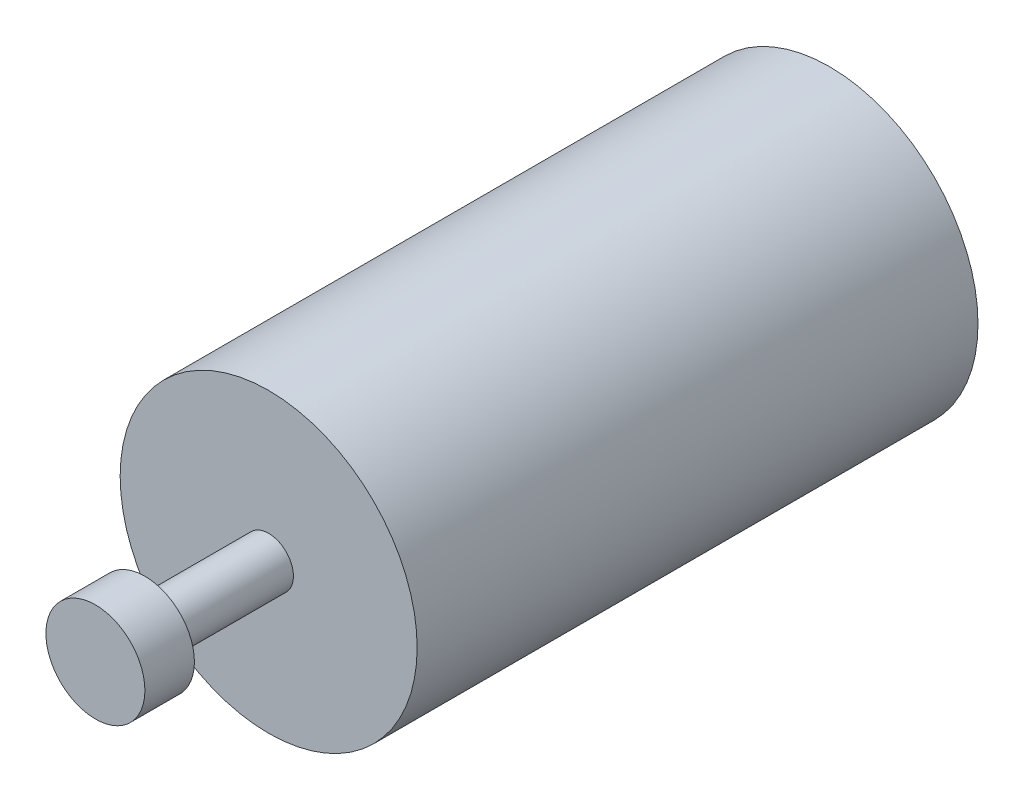
ISO-10303-21;
HEADER;
FILE_DESCRIPTION(('STEP AP214'),'2;1');
FILE_NAME('part.step','',(''),(''),'','','');
FILE_SCHEMA(('AUTOMOTIVE_DESIGN { 1 0 10303 214 1 1 1 1 }'));
ENDSEC;
DATA;
#1=APPLICATION_CONTEXT('core data for automotive mechanical design processes');
#2=APPLICATION_PROTOCOL_DEFINITION('international standard','automotive_design',2000,#1);
#3=PRODUCT_CONTEXT('',#1,'mechanical');
#4=PRODUCT('Part','Part','',(#3));
#5=PRODUCT_RELATED_PRODUCT_CATEGORY('part','',(#4));
#6=PRODUCT_DEFINITION_FORMATION('','',#4);
#7=PRODUCT_DEFINITION_CONTEXT('part definition',#1,'design');
#8=PRODUCT_DEFINITION('design','',#6,#7);
#9=PRODUCT_DEFINITION_SHAPE('','',#8);
#10=(LENGTH_UNIT() NAMED_UNIT(*) SI_UNIT(.MILLI.,.METRE.));
#11=(NAMED_UNIT(*) PLANE_ANGLE_UNIT() SI_UNIT($,.RADIAN.));
#12=(NAMED_UNIT(*) SI_UNIT($,.STERADIAN.) SOLID_ANGLE_UNIT());
#13=UNCERTAINTY_MEASURE_WITH_UNIT(LENGTH_MEASURE(1.E-05),#10,'distance_accuracy_value','');
#14=(GEOMETRIC_REPRESENTATION_CONTEXT(3) GLOBAL_UNCERTAINTY_ASSIGNED_CONTEXT((#13)) GLOBAL_UNIT_ASSIGNED_CONTEXT((#10,
#11,#12)) REPRESENTATION_CONTEXT('',''));
#15=CARTESIAN_POINT('',(0.,0.,0.));
#16=DIRECTION('',(0.,0.,1.));
#17=DIRECTION('',(1.,0.,0.));
#18=AXIS2_PLACEMENT_3D('',#15,#16,#17);
#19=CARTESIAN_POINT('',(0.,0.,14.478));
#20=DIRECTION('',(0.,0.,-1.));
#21=DIRECTION('',(-1.,0.,0.));
#22=AXIS2_PLACEMENT_3D('',#19,#20,#21);
#23=CYLINDRICAL_SURFACE('',#22,3.175);
#24=CARTESIAN_POINT('',(0.,0.,0.));
#25=DIRECTION('',(0.,0.,1.));
#26=DIRECTION('',(1.,0.,0.));
#27=AXIS2_PLACEMENT_3D('',#24,#25,#26);
#28=CIRCLE('',#27,3.175);
#29=CARTESIAN_POINT('',(-1.27,2.90993556629696,0.));
#30=VERTEX_POINT('',#29);
#31=CARTESIAN_POINT('',(1.27,2.90993556629696,0.));
#32=VERTEX_POINT('',#31);
#33=EDGE_CURVE('E87',#30,#32,#28,.T.);
#34=ORIENTED_EDGE('',*,*,#33,.T.);
#35=DIRECTION('',(0.,0.,-1.));
#36=VECTOR('',#35,1.);
#37=CARTESIAN_POINT('',(1.27,2.90993556629696,14.478));
#38=LINE('',#37,#36);
#39=CARTESIAN_POINT('',(1.27,2.90993556629696,14.478));
#40=VERTEX_POINT('',#39);
#41=EDGE_CURVE('E89',#32,#40,#38,.F.);
#42=ORIENTED_EDGE('',*,*,#41,.T.);
#43=CARTESIAN_POINT('',(0.,0.,14.478));
#44=DIRECTION('',(0.,0.,1.));
#45=DIRECTION('',(1.,0.,0.));
#46=AXIS2_PLACEMENT_3D('',#43,#44,#45);
#47=CIRCLE('',#46,3.175);
#48=CARTESIAN_POINT('',(-1.27,2.90993556629696,14.478));
#49=VERTEX_POINT('',#48);
#50=EDGE_CURVE('E95',#49,#40,#47,.T.);
#51=ORIENTED_EDGE('',*,*,#50,.F.);
#52=DIRECTION('',(0.,0.,-1.));
#53=VECTOR('',#52,1.);
#54=CARTESIAN_POINT('',(-1.27,2.90993556629696,14.478));
#55=LINE('',#54,#53);
#56=EDGE_CURVE('E61',#49,#30,#55,.T.);
#57=ORIENTED_EDGE('',*,*,#56,.T.);
#58=EDGE_LOOP('',(#34,#42,#51,#57));
#59=FACE_BOUND('',#58,.T.);
#60=ADVANCED_FACE('F45',(#59),#23,.T.);
#61=CARTESIAN_POINT('',(0.,0.,158.369));
#62=DIRECTION('',(0.,0.,-1.));
#63=DIRECTION('',(-1.,0.,0.));
#64=AXIS2_PLACEMENT_3D('',#61,#62,#63);
#65=CYLINDRICAL_SURFACE('',#64,38.1);
#66=CARTESIAN_POINT('',(0.,0.,158.369));
#67=DIRECTION('',(0.,0.,1.));
#68=DIRECTION('',(1.,0.,0.));
#69=AXIS2_PLACEMENT_3D('',#66,#67,#68);
#70=CIRCLE('',#69,38.1);
#71=CARTESIAN_POINT('',(38.1,0.,158.369));
#72=VERTEX_POINT('',#71);
#73=EDGE_CURVE('E96',#72,#72,#70,.T.);
#74=ORIENTED_EDGE('',*,*,#73,.F.);
#75=EDGE_LOOP('',(#74));
#76=FACE_BOUND('',#75,.T.);
#77=CARTESIAN_POINT('',(0.,0.,14.478));
#78=DIRECTION('',(0.,0.,1.));
#79=DIRECTION('',(1.,0.,0.));
#80=AXIS2_PLACEMENT_3D('',#77,#78,#79);
#81=CIRCLE('',#80,38.1);
#82=CARTESIAN_POINT('',(38.1,0.,14.478));
#83=VERTEX_POINT('',#82);
#84=EDGE_CURVE('E102',#83,#83,#81,.T.);
#85=ORIENTED_EDGE('',*,*,#84,.T.);
#86=EDGE_LOOP('',(#85));
#87=FACE_BOUND('',#86,.T.);
#88=ADVANCED_FACE('F164',(#76,#87),#65,.T.);
#89=CARTESIAN_POINT('',(0.,0.,158.369));
#90=DIRECTION('',(0.,0.,1.));
#91=DIRECTION('',(1.,0.,0.));
#92=AXIS2_PLACEMENT_3D('',#89,#90,#91);
#93=PLANE('',#92);
#94=CARTESIAN_POINT('',(0.,0.,158.369));
#95=DIRECTION('',(0.,0.,1.));
#96=DIRECTION('',(1.,0.,0.));
#97=AXIS2_PLACEMENT_3D('',#94,#95,#96);
#98=CIRCLE('',#97,6.35);
#99=CARTESIAN_POINT('',(6.35,0.,158.369));
#100=VERTEX_POINT('',#99);
#101=EDGE_CURVE('E11',#100,#100,#98,.T.);
#102=ORIENTED_EDGE('',*,*,#101,.F.);
#103=EDGE_LOOP('',(#102));
#104=FACE_BOUND('',#103,.T.);
#105=ORIENTED_EDGE('',*,*,#73,.T.);
#106=EDGE_LOOP('',(#105));
#107=FACE_BOUND('',#106,.T.);
#108=ADVANCED_FACE('F170',(#104,#107),#93,.T.);
#109=CARTESIAN_POINT('',(0.,0.,14.478));
#110=DIRECTION('',(0.,0.,1.));
#111=DIRECTION('',(1.,0.,0.));
#112=AXIS2_PLACEMENT_3D('',#109,#110,#111);
#113=PLANE('',#112);
#114=ORIENTED_EDGE('',*,*,#50,.T.);
#115=DIRECTION('',(0.,-1.,0.));
#116=VECTOR('',#115,1.);
#117=CARTESIAN_POINT('',(1.27,5.715,14.478));
#118=LINE('',#117,#116);
#119=CARTESIAN_POINT('',(1.27,5.715,14.478));
#120=VERTEX_POINT('',#119);
#121=EDGE_CURVE('E69',#120,#40,#118,.T.);
#122=ORIENTED_EDGE('',*,*,#121,.F.);
#123=DIRECTION('',(1.,0.,0.));
#124=VECTOR('',#123,1.);
#125=CARTESIAN_POINT('',(1.27,5.715,14.478));
#126=LINE('',#125,#124);
#127=CARTESIAN_POINT('',(-1.27,5.715,14.478));
#128=VERTEX_POINT('',#127);
#129=EDGE_CURVE('E109',#128,#120,#126,.T.);
#130=ORIENTED_EDGE('',*,*,#129,.F.);
#131=DIRECTION('',(0.,-1.,0.));
#132=VECTOR('',#131,1.);
#133=CARTESIAN_POINT('',(-1.27,0.,14.478));
#134=LINE('',#133,#132);
#135=EDGE_CURVE('E48',#128,#49,#134,.T.);
#136=ORIENTED_EDGE('',*,*,#135,.T.);
#137=EDGE_LOOP('',(#114,#122,#130,#136));
#138=FACE_BOUND('',#137,.T.);
#139=ORIENTED_EDGE('',*,*,#84,.F.);
#140=EDGE_LOOP('',(#139));
#141=FACE_BOUND('',#140,.T.);
#142=ADVANCED_FACE('F144',(#138,#141),#113,.F.);
#143=CARTESIAN_POINT('',(1.27,5.715,20.1576126628495));
#144=DIRECTION('',(1.,0.,0.));
#145=DIRECTION('',(0.,1.,0.));
#146=AXIS2_PLACEMENT_3D('',#143,#144,#145);
#147=PLANE('',#146);
#148=ORIENTED_EDGE('',*,*,#41,.F.);
#149=DIRECTION('',(0.,-1.,0.));
#150=VECTOR('',#149,1.);
#151=CARTESIAN_POINT('',(1.27,5.715,0.));
#152=LINE('',#151,#150);
#153=CARTESIAN_POINT('',(1.27,5.715,0.));
#154=VERTEX_POINT('',#153);
#155=EDGE_CURVE('E99',#154,#32,#152,.T.);
#156=ORIENTED_EDGE('',*,*,#155,.F.);
#157=DIRECTION('',(0.,0.,-1.));
#158=VECTOR('',#157,1.);
#159=CARTESIAN_POINT('',(1.27,5.715,20.1576126628495));
#160=LINE('',#159,#158);
#161=EDGE_CURVE('E114',#120,#154,#160,.T.);
#162=ORIENTED_EDGE('',*,*,#161,.F.);
#163=ORIENTED_EDGE('',*,*,#121,.T.);
#164=EDGE_LOOP('',(#148,#156,#162,#163));
#165=FACE_BOUND('',#164,.T.);
#166=ADVANCED_FACE('F98',(#165),#147,.T.);
#167=CARTESIAN_POINT('',(-1.27,5.715,20.1576126628495));
#168=DIRECTION('',(-1.,0.,0.));
#169=DIRECTION('',(0.,-1.,0.));
#170=AXIS2_PLACEMENT_3D('',#167,#168,#169);
#171=PLANE('',#170);
#172=ORIENTED_EDGE('',*,*,#56,.F.);
#173=ORIENTED_EDGE('',*,*,#135,.F.);
#174=DIRECTION('',(0.,0.,-1.));
#175=VECTOR('',#174,1.);
#176=CARTESIAN_POINT('',(-1.27,5.715,20.1576126628495));
#177=LINE('',#176,#175);
#178=CARTESIAN_POINT('',(-1.27,5.715,0.));
#179=VERTEX_POINT('',#178);
#180=EDGE_CURVE('E127',#128,#179,#177,.T.);
#181=ORIENTED_EDGE('',*,*,#180,.T.);
#182=DIRECTION('',(0.,1.,0.));
#183=VECTOR('',#182,1.);
#184=CARTESIAN_POINT('',(-1.27,5.715,0.));
#185=LINE('',#184,#183);
#186=EDGE_CURVE('E116',#30,#179,#185,.T.);
#187=ORIENTED_EDGE('',*,*,#186,.F.);
#188=EDGE_LOOP('',(#172,#173,#181,#187));
#189=FACE_BOUND('',#188,.T.);
#190=ADVANCED_FACE('F147',(#189),#171,.T.);
#191=CARTESIAN_POINT('',(1.27,5.715,20.1576126628495));
#192=DIRECTION('',(0.,1.,0.));
#193=DIRECTION('',(0.,0.,1.));
#194=AXIS2_PLACEMENT_3D('',#191,#192,#193);
#195=PLANE('',#194);
#196=ORIENTED_EDGE('',*,*,#180,.F.);
#197=ORIENTED_EDGE('',*,*,#129,.T.);
#198=ORIENTED_EDGE('',*,*,#161,.T.);
#199=DIRECTION('',(1.,0.,0.));
#200=VECTOR('',#199,1.);
#201=CARTESIAN_POINT('',(1.27,5.715,0.));
#202=LINE('',#201,#200);
#203=EDGE_CURVE('E107',#179,#154,#202,.T.);
#204=ORIENTED_EDGE('',*,*,#203,.F.);
#205=EDGE_LOOP('',(#196,#197,#198,#204));
#206=FACE_BOUND('',#205,.T.);
#207=ADVANCED_FACE('F149',(#206),#195,.T.);
#208=CARTESIAN_POINT('',(0.,0.,-5.08));
#209=DIRECTION('',(0.,0.,1.));
#210=DIRECTION('',(1.,0.,0.));
#211=AXIS2_PLACEMENT_3D('',#208,#209,#210);
#212=CYLINDRICAL_SURFACE('',#211,5.99953324439615);
#213=CARTESIAN_POINT('',(0.,0.,-5.08));
#214=DIRECTION('',(0.,0.,-1.));
#215=DIRECTION('',(-1.,0.,0.));
#216=AXIS2_PLACEMENT_3D('',#213,#214,#215);
#217=CIRCLE('',#216,5.99953324439615);
#218=CARTESIAN_POINT('',(-5.99953324439615,0.,-5.08));
#219=VERTEX_POINT('',#218);
#220=EDGE_CURVE('E123',#219,#219,#217,.T.);
#221=ORIENTED_EDGE('',*,*,#220,.F.);
#222=EDGE_LOOP('',(#221));
#223=FACE_BOUND('',#222,.T.);
#224=CARTESIAN_POINT('',(0.,0.,0.));
#225=DIRECTION('',(0.,0.,-1.));
#226=DIRECTION('',(-1.,0.,0.));
#227=AXIS2_PLACEMENT_3D('',#224,#225,#226);
#228=CIRCLE('',#227,5.99953324439615);
#229=CARTESIAN_POINT('',(-5.99953324439615,0.,0.));
#230=VERTEX_POINT('',#229);
#231=EDGE_CURVE('E119',#230,#230,#228,.T.);
#232=ORIENTED_EDGE('',*,*,#231,.T.);
#233=EDGE_LOOP('',(#232));
#234=FACE_BOUND('',#233,.T.);
#235=ADVANCED_FACE('F151',(#223,#234),#212,.T.);
#236=CARTESIAN_POINT('',(0.,0.,-5.08));
#237=DIRECTION('',(0.,0.,-1.));
#238=DIRECTION('',(-1.,0.,0.));
#239=AXIS2_PLACEMENT_3D('',#236,#237,#238);
#240=PLANE('',#239);
#241=ORIENTED_EDGE('',*,*,#220,.T.);
#242=EDGE_LOOP('',(#241));
#243=FACE_BOUND('',#242,.T.);
#244=ADVANCED_FACE('F157',(#243),#240,.T.);
#245=CARTESIAN_POINT('',(0.,0.,0.));
#246=DIRECTION('',(0.,0.,-1.));
#247=DIRECTION('',(-1.,0.,0.));
#248=AXIS2_PLACEMENT_3D('',#245,#246,#247);
#249=PLANE('',#248);
#250=ORIENTED_EDGE('',*,*,#33,.F.);
#251=ORIENTED_EDGE('',*,*,#186,.T.);
#252=ORIENTED_EDGE('',*,*,#203,.T.);
#253=ORIENTED_EDGE('',*,*,#155,.T.);
#254=EDGE_LOOP('',(#250,#251,#252,#253));
#255=FACE_BOUND('',#254,.T.);
#256=ORIENTED_EDGE('',*,*,#231,.F.);
#257=EDGE_LOOP('',(#256));
#258=FACE_BOUND('',#257,.T.);
#259=ADVANCED_FACE('F104',(#255,#258),#249,.F.);
#260=CARTESIAN_POINT('',(0.,0.,190.119));
#261=DIRECTION('',(0.,0.,-1.));
#262=DIRECTION('',(-1.,0.,0.));
#263=AXIS2_PLACEMENT_3D('',#260,#261,#262);
#264=CYLINDRICAL_SURFACE('',#263,6.35);
#265=CARTESIAN_POINT('',(0.,0.,190.119));
#266=DIRECTION('',(0.,0.,1.));
#267=DIRECTION('',(1.,0.,0.));
#268=AXIS2_PLACEMENT_3D('',#265,#266,#267);
#269=CIRCLE('',#268,6.35);
#270=CARTESIAN_POINT('',(6.35,0.,190.119));
#271=VERTEX_POINT('',#270);
#272=EDGE_CURVE('E210',#271,#271,#269,.T.);
#273=ORIENTED_EDGE('',*,*,#272,.F.);
#274=EDGE_LOOP('',(#273));
#275=FACE_BOUND('',#274,.T.);
#276=ORIENTED_EDGE('',*,*,#101,.T.);
#277=EDGE_LOOP('',(#276));
#278=FACE_BOUND('',#277,.T.);
#279=ADVANCED_FACE('F186',(#275,#278),#264,.T.);
#280=CARTESIAN_POINT('',(0.,0.,202.819));
#281=DIRECTION('',(0.,0.,-1.));
#282=DIRECTION('',(-1.,0.,0.));
#283=AXIS2_PLACEMENT_3D('',#280,#281,#282);
#284=CYLINDRICAL_SURFACE('',#283,12.7);
#285=CARTESIAN_POINT('',(0.,0.,202.819));
#286=DIRECTION('',(0.,0.,1.));
#287=DIRECTION('',(1.,0.,0.));
#288=AXIS2_PLACEMENT_3D('',#285,#286,#287);
#289=CIRCLE('',#288,12.7);
#290=CARTESIAN_POINT('',(12.7,0.,202.819));
#291=VERTEX_POINT('',#290);
#292=EDGE_CURVE('E208',#291,#291,#289,.T.);
#293=ORIENTED_EDGE('',*,*,#292,.F.);
#294=EDGE_LOOP('',(#293));
#295=FACE_BOUND('',#294,.T.);
#296=CARTESIAN_POINT('',(0.,0.,190.119));
#297=DIRECTION('',(0.,0.,1.));
#298=DIRECTION('',(1.,0.,0.));
#299=AXIS2_PLACEMENT_3D('',#296,#297,#298);
#300=CIRCLE('',#299,12.7);
#301=CARTESIAN_POINT('',(12.7,0.,190.119));
#302=VERTEX_POINT('',#301);
#303=EDGE_CURVE('E211',#302,#302,#300,.T.);
#304=ORIENTED_EDGE('',*,*,#303,.T.);
#305=EDGE_LOOP('',(#304));
#306=FACE_BOUND('',#305,.T.);
#307=ADVANCED_FACE('F192',(#295,#306),#284,.T.);
#308=CARTESIAN_POINT('',(0.,0.,202.819));
#309=DIRECTION('',(0.,0.,1.));
#310=DIRECTION('',(1.,0.,0.));
#311=AXIS2_PLACEMENT_3D('',#308,#309,#310);
#312=PLANE('',#311);
#313=ORIENTED_EDGE('',*,*,#292,.T.);
#314=EDGE_LOOP('',(#313));
#315=FACE_BOUND('',#314,.T.);
#316=ADVANCED_FACE('F196',(#315),#312,.T.);
#317=CARTESIAN_POINT('',(0.,0.,190.119));
#318=DIRECTION('',(0.,0.,1.));
#319=DIRECTION('',(1.,0.,0.));
#320=AXIS2_PLACEMENT_3D('',#317,#318,#319);
#321=PLANE('',#320);
#322=ORIENTED_EDGE('',*,*,#272,.T.);
#323=EDGE_LOOP('',(#322));
#324=FACE_BOUND('',#323,.T.);
#325=ORIENTED_EDGE('',*,*,#303,.F.);
#326=EDGE_LOOP('',(#325));
#327=FACE_BOUND('',#326,.T.);
#328=ADVANCED_FACE('F198',(#324,#327),#321,.F.);
#329=CLOSED_SHELL('',(#60,#88,#108,#142,#166,#190,#207,#235,#244,#259,#279,#307,#316,#328));
#330=MANIFOLD_SOLID_BREP('B2',#329);
#331=ADVANCED_BREP_SHAPE_REPRESENTATION('',(#18,#330),#14);
#332=SHAPE_DEFINITION_REPRESENTATION(#9,#331);
ENDSEC;
END-ISO-10303-21;
